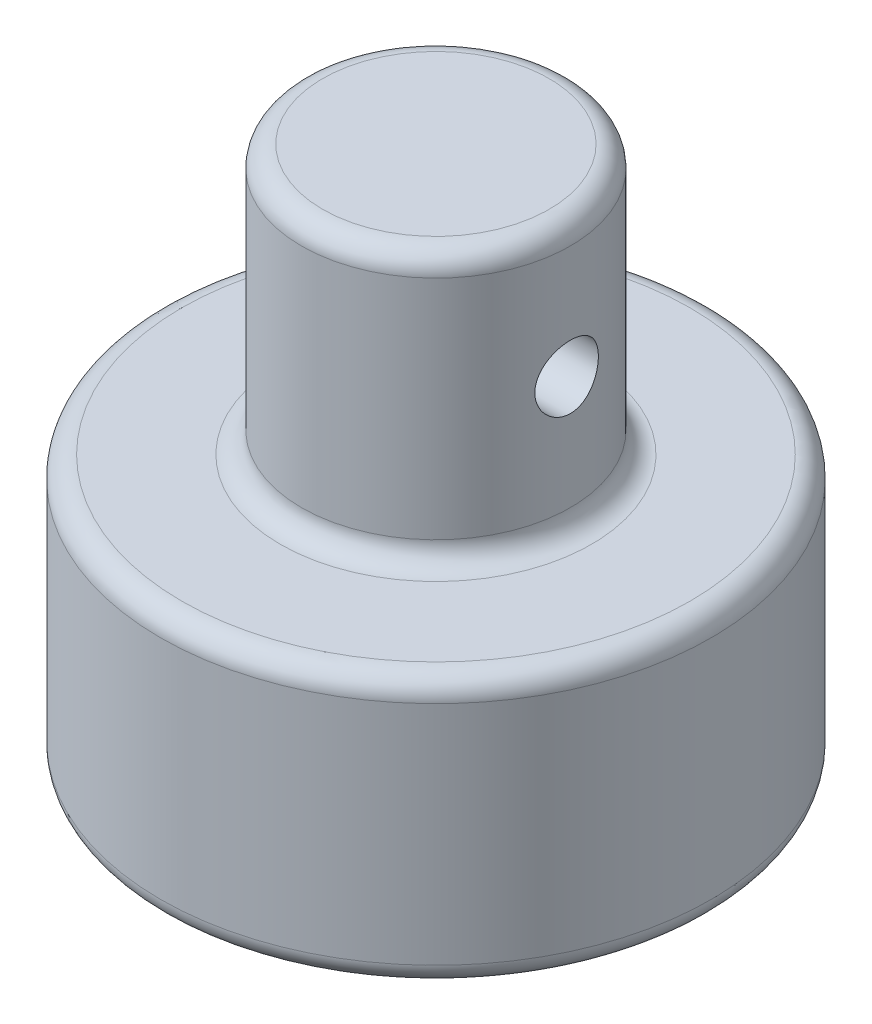
ISO-10303-21;
HEADER;
FILE_DESCRIPTION(('STEP AP214'),'2;1');
FILE_NAME('part.step','',(''),(''),'','','');
FILE_SCHEMA(('AUTOMOTIVE_DESIGN { 1 0 10303 214 1 1 1 1 }'));
ENDSEC;
DATA;
#1=APPLICATION_CONTEXT('core data for automotive mechanical design processes');
#2=APPLICATION_PROTOCOL_DEFINITION('international standard','automotive_design',2000,#1);
#3=PRODUCT_CONTEXT('',#1,'mechanical');
#4=PRODUCT('Part','Part','',(#3));
#5=PRODUCT_RELATED_PRODUCT_CATEGORY('part','',(#4));
#6=PRODUCT_DEFINITION_FORMATION('','',#4);
#7=PRODUCT_DEFINITION_CONTEXT('part definition',#1,'design');
#8=PRODUCT_DEFINITION('design','',#6,#7);
#9=PRODUCT_DEFINITION_SHAPE('','',#8);
#10=(LENGTH_UNIT() NAMED_UNIT(*) SI_UNIT(.MILLI.,.METRE.));
#11=(NAMED_UNIT(*) PLANE_ANGLE_UNIT() SI_UNIT($,.RADIAN.));
#12=(NAMED_UNIT(*) SI_UNIT($,.STERADIAN.) SOLID_ANGLE_UNIT());
#13=UNCERTAINTY_MEASURE_WITH_UNIT(LENGTH_MEASURE(1.E-05),#10,'distance_accuracy_value','');
#14=(GEOMETRIC_REPRESENTATION_CONTEXT(3) GLOBAL_UNCERTAINTY_ASSIGNED_CONTEXT((#13)) GLOBAL_UNIT_ASSIGNED_CONTEXT((#10,
#11,#12)) REPRESENTATION_CONTEXT('',''));
#15=CARTESIAN_POINT('',(0.,0.,0.));
#16=DIRECTION('',(0.,0.,1.));
#17=DIRECTION('',(1.,0.,0.));
#18=AXIS2_PLACEMENT_3D('',#15,#16,#17);
#19=CARTESIAN_POINT('',(0.,12.7,0.));
#20=DIRECTION('',(0.,-1.,0.));
#21=DIRECTION('',(0.,0.,-1.));
#22=AXIS2_PLACEMENT_3D('',#19,#20,#21);
#23=CYLINDRICAL_SURFACE('',#22,3.175);
#24=CARTESIAN_POINT('',(0.,12.2,0.));
#25=DIRECTION('',(0.,1.,0.));
#26=DIRECTION('',(0.,0.,1.));
#27=AXIS2_PLACEMENT_3D('',#24,#25,#26);
#28=CIRCLE('',#27,3.175);
#29=CARTESIAN_POINT('',(0.,12.2,3.175));
#30=VERTEX_POINT('',#29);
#31=EDGE_CURVE('E42',#30,#30,#28,.F.);
#32=ORIENTED_EDGE('',*,*,#31,.T.);
#33=EDGE_LOOP('',(#32));
#34=FACE_BOUND('',#33,.T.);
#35=CARTESIAN_POINT('',(0.,6.85,0.));
#36=DIRECTION('',(0.,1.,0.));
#37=DIRECTION('',(0.,0.,1.));
#38=AXIS2_PLACEMENT_3D('',#35,#36,#37);
#39=CIRCLE('',#38,3.175);
#40=CARTESIAN_POINT('',(0.,6.85,3.175));
#41=VERTEX_POINT('',#40);
#42=EDGE_CURVE('E46',#41,#41,#39,.T.);
#43=ORIENTED_EDGE('',*,*,#42,.T.);
#44=EDGE_LOOP('',(#43));
#45=FACE_BOUND('',#44,.T.);
#46=CARTESIAN_POINT('',(-3.08514586365053,9.525,0.75));
#47=CARTESIAN_POINT('',(-3.08514668896926,9.56649225643454,0.749998699655734));
#48=CARTESIAN_POINT('',(-3.08599204166002,9.60799944409923,0.746545063183195));
#49=CARTESIAN_POINT('',(-3.08927459498372,9.68982715153479,0.732840613698552));
#50=CARTESIAN_POINT('',(-3.0917128236692,9.73014688734081,0.722585410846177));
#51=CARTESIAN_POINT('',(-3.09788992836472,9.80840426361994,0.6956239444874));
#52=CARTESIAN_POINT('',(-3.10162724036179,9.84634470406624,0.678925435658918));
#53=CARTESIAN_POINT('',(-3.10997949528248,9.91888829161726,0.639574379245872));
#54=CARTESIAN_POINT('',(-3.11459445057715,9.95349139166926,0.616921747731687));
#55=CARTESIAN_POINT('',(-3.12428352892521,10.0190587833184,0.565830002157809));
#56=CARTESIAN_POINT('',(-3.12936433482267,10.0499478042755,0.537295540706709));
#57=CARTESIAN_POINT('',(-3.13935442508066,10.1065488701819,0.475455716733856));
#58=CARTESIAN_POINT('',(-3.144263694653,10.1322604696896,0.442149944131872));
#59=CARTESIAN_POINT('',(-3.15343099297809,10.1780801564261,0.371202233287074));
#60=CARTESIAN_POINT('',(-3.15768021537604,10.1981149995139,0.333511756182037));
#61=CARTESIAN_POINT('',(-3.16497274840128,10.2315373115901,0.255181288309081));
#62=CARTESIAN_POINT('',(-3.16801621736345,10.2449256534299,0.214541685638768));
#63=CARTESIAN_POINT('',(-3.17250709203822,10.2644357980443,0.132250407441323));
#64=CARTESIAN_POINT('',(-3.17398249847803,10.2706852367638,0.0906305468698862));
#65=CARTESIAN_POINT('',(-3.17526833011845,10.2761400985008,0.00690875719543005));
#66=CARTESIAN_POINT('',(-3.17507897609403,10.2753464555483,-0.035193107246283));
#67=CARTESIAN_POINT('',(-3.17307771962571,10.2668309712607,-0.117801007212341));
#68=CARTESIAN_POINT('',(-3.17129806206527,10.2592468080681,-0.158322132567599));
#69=CARTESIAN_POINT('',(-3.16635333031269,10.2375859988044,-0.237499581070946));
#70=CARTESIAN_POINT('',(-3.16318818708796,10.2235090292236,-0.276155811193009));
#71=CARTESIAN_POINT('',(-3.15577763422695,10.1891461179859,-0.350877735450184));
#72=CARTESIAN_POINT('',(-3.15152349750181,10.1688097341573,-0.386919331372022));
#73=CARTESIAN_POINT('',(-3.14239874221514,10.1225432208452,-0.455127485192185));
#74=CARTESIAN_POINT('',(-3.1375280268937,10.0966122129442,-0.487293433333832));
#75=CARTESIAN_POINT('',(-3.1275639356673,10.0391491200711,-0.547657439615753));
#76=CARTESIAN_POINT('',(-3.12246802405523,10.0074966114115,-0.575740555961048));
#77=CARTESIAN_POINT('',(-3.11273697520834,9.93987810522371,-0.626223926852375));
#78=CARTESIAN_POINT('',(-3.10810185505198,9.90391194792634,-0.648623970812585));
#79=CARTESIAN_POINT('',(-3.09980911131487,9.82847985280552,-0.687168473588018));
#80=CARTESIAN_POINT('',(-3.0961554015624,9.78900071418787,-0.703287997687938));
#81=CARTESIAN_POINT('',(-3.09029097273593,9.70778641412193,-0.728627245010572));
#82=CARTESIAN_POINT('',(-3.08807998196653,9.66605167905551,-0.737848267419286));
#83=CARTESIAN_POINT('',(-3.08540764265613,9.58256971063367,-0.748943766722535));
#84=CARTESIAN_POINT('',(-3.08490610896531,9.54084616771512,-0.750987011548172));
#85=CARTESIAN_POINT('',(-3.08560053051669,9.45765450591881,-0.748128667586499));
#86=CARTESIAN_POINT('',(-3.08679634789464,9.41618636657112,-0.743227642834893));
#87=CARTESIAN_POINT('',(-3.09071247686468,9.3352913390079,-0.726767178663562));
#88=CARTESIAN_POINT('',(-3.0934108350967,9.29584379103943,-0.715303557948252));
#89=CARTESIAN_POINT('',(-3.10000763947436,9.21942973735453,-0.686148403649578));
#90=CARTESIAN_POINT('',(-3.10390621571075,9.18246350111495,-0.668456194924241));
#91=CARTESIAN_POINT('',(-3.11255046676841,9.11133934800395,-0.626984422838589));
#92=CARTESIAN_POINT('',(-3.11730992644009,9.07724279265536,-0.603102559124364));
#93=CARTESIAN_POINT('',(-3.12710472283704,9.01347919120149,-0.550060780512039));
#94=CARTESIAN_POINT('',(-3.13214009975032,8.98381279271568,-0.52090009530867));
#95=CARTESIAN_POINT('',(-3.14205387017239,8.92908106085406,-0.457358782246775));
#96=CARTESIAN_POINT('',(-3.14692634672054,8.90413171806595,-0.422877157292954));
#97=CARTESIAN_POINT('',(-3.15584949293842,8.86037877034749,-0.350114896765158));
#98=CARTESIAN_POINT('',(-3.1599002038756,8.84157485677695,-0.31183445210417));
#99=CARTESIAN_POINT('',(-3.16669883080338,8.81080025065212,-0.232816585023149));
#100=CARTESIAN_POINT('',(-3.16945566324685,8.79878267133792,-0.192098226076688));
#101=CARTESIAN_POINT('',(-3.1733947431689,8.78177822559625,-0.109147060387728));
#102=CARTESIAN_POINT('',(-3.17457725998794,8.77679015652248,-0.06691451396867));
#103=CARTESIAN_POINT('',(-3.17522483844584,8.77404784145799,0.0167714737738158));
#104=CARTESIAN_POINT('',(-3.1747307499349,8.7761215425476,0.0582190516315513));
#105=CARTESIAN_POINT('',(-3.17216982115589,8.78705403632335,0.14015720888946));
#106=CARTESIAN_POINT('',(-3.17010301880818,8.79591266541523,0.180647811339406));
#107=CARTESIAN_POINT('',(-3.16463373692052,8.82007555758405,0.259363838319269));
#108=CARTESIAN_POINT('',(-3.16123708133291,8.83535173668918,0.297598314347804));
#109=CARTESIAN_POINT('',(-3.15346796297977,8.87188998424496,0.370982424318939));
#110=CARTESIAN_POINT('',(-3.14909538940119,8.89315273252731,0.406131707313622));
#111=CARTESIAN_POINT('',(-3.13972971971794,8.94160183781537,0.473174460292336));
#112=CARTESIAN_POINT('',(-3.13472520051864,8.96890691929889,0.504980541561487));
#113=CARTESIAN_POINT('',(-3.12471547407835,9.02843095166842,0.563617812471413));
#114=CARTESIAN_POINT('',(-3.11971026697297,9.06065111525591,0.59044777072009));
#115=CARTESIAN_POINT('',(-3.11017456306961,9.12971800766053,0.638793952479309));
#116=CARTESIAN_POINT('',(-3.10565305429953,9.16663114180078,0.660217206081042));
#117=CARTESIAN_POINT('',(-3.09771371445937,9.24363511299557,0.69652180308972));
#118=CARTESIAN_POINT('',(-3.09429502005866,9.28372343360348,0.711408267091613));
#119=CARTESIAN_POINT('',(-3.08952792485525,9.35732923306428,0.731796664056163));
#120=CARTESIAN_POINT('',(-3.08789633346475,9.39047159435581,0.738608876275777));
#121=CARTESIAN_POINT('',(-3.08570500249943,9.45740602969743,0.747710922812881));
#122=CARTESIAN_POINT('',(-3.0851451912992,9.4911980601787,0.750001059334016));
#123=CARTESIAN_POINT('',(-3.08514586365053,9.525,0.75));
#124=B_SPLINE_CURVE_WITH_KNOTS('',3,(#46,#47,#48,#49,#50,#51,#52,#53,#54,#55,#56,#57,#58,#59,
#60,#61,#62,#63,#64,#65,#66,#67,#68,#69,#70,#71,#72,#73,#74,#75,#76,#77,#78,#79,#80,#81,#82,#83,
#84,#85,#86,#87,#88,#89,#90,#91,#92,#93,#94,#95,#96,#97,#98,#99,#100,#101,#102,#103,#104,#105,
#106,#107,#108,#109,#110,#111,#112,#113,#114,#115,#116,#117,#118,#119,#120,#121,#122,#123),
.UNSPECIFIED.,.T.,.F.,(4,2,2,2,2,2,2,2,2,2,2,2,2,2,2,2,2,2,2,2,2,2,2,2,2,2,2,2,2,2,2,2,2,2,2,2,
2,2,4),(0.,0.124352756597841,0.248785850668864,0.373069651205348,0.497355203746668,
0.623841196362167,0.75033806660792,0.878399589302627,1.00644428987362,1.13216198242116,
1.25786300296017,1.38107173556274,1.50428660780916,1.62852163687889,1.75277618642629,
1.88003952195612,2.0073075725308,2.13507587161651,2.26282010220036,2.38753986054616,
2.51224948933644,2.63518308677905,2.75813001359882,2.88325528425149,3.00839882838906,
3.13630418523094,3.2642031173301,3.39120723181059,3.51818961510713,3.64210055717242,
3.7660085116628,3.8893797872764,4.01276507852263,4.13883263237193,4.26493134141276,
4.39306971156921,4.52110752466599,4.62241908709417,4.723723878791),.UNSPECIFIED.);
#125=CARTESIAN_POINT('',(-3.08514586365053,9.525,0.75));
#126=VERTEX_POINT('',#125);
#127=EDGE_CURVE('E70',#126,#126,#124,.T.);
#128=ORIENTED_EDGE('',*,*,#127,.F.);
#129=EDGE_LOOP('',(#128));
#130=FACE_BOUND('',#129,.T.);
#131=CARTESIAN_POINT('',(3.08514586365053,9.525,0.75));
#132=CARTESIAN_POINT('',(3.08514668896926,9.48350774356545,0.749998699655734));
#133=CARTESIAN_POINT('',(3.08599204166002,9.44200055590077,0.746545063183195));
#134=CARTESIAN_POINT('',(3.08927459498372,9.36017284846521,0.732840613698552));
#135=CARTESIAN_POINT('',(3.0917128236692,9.31985311265919,0.722585410846177));
#136=CARTESIAN_POINT('',(3.09788992836472,9.24159573638006,0.6956239444874));
#137=CARTESIAN_POINT('',(3.10162724036179,9.20365529593376,0.678925435658918));
#138=CARTESIAN_POINT('',(3.10997949528248,9.13111170838274,0.639574379245872));
#139=CARTESIAN_POINT('',(3.11459445057715,9.09650860833074,0.616921747731687));
#140=CARTESIAN_POINT('',(3.12428352892521,9.03094121668163,0.565830002157809));
#141=CARTESIAN_POINT('',(3.12936433482267,9.00005219572447,0.537295540706709));
#142=CARTESIAN_POINT('',(3.13935442508066,8.94345112981805,0.475455716733856));
#143=CARTESIAN_POINT('',(3.144263694653,8.91773953031042,0.442149944131872));
#144=CARTESIAN_POINT('',(3.15343099297809,8.8719198435739,0.371202233287074));
#145=CARTESIAN_POINT('',(3.15768021537604,8.85188500048607,0.333511756182037));
#146=CARTESIAN_POINT('',(3.16497274840128,8.81846268840987,0.255181288309081));
#147=CARTESIAN_POINT('',(3.16801621736345,8.80507434657011,0.214541685638768));
#148=CARTESIAN_POINT('',(3.17250709203822,8.7855642019557,0.132250407441323));
#149=CARTESIAN_POINT('',(3.17398249847803,8.77931476323623,0.0906305468698862));
#150=CARTESIAN_POINT('',(3.17526833011845,8.77385990149915,0.00690875719543005));
#151=CARTESIAN_POINT('',(3.17507897609403,8.77465354445174,-0.035193107246283));
#152=CARTESIAN_POINT('',(3.17307771962571,8.78316902873931,-0.117801007212341));
#153=CARTESIAN_POINT('',(3.17129806206527,8.79075319193186,-0.158322132567599));
#154=CARTESIAN_POINT('',(3.16635333031269,8.8124140011956,-0.237499581070946));
#155=CARTESIAN_POINT('',(3.16318818708796,8.82649097077644,-0.276155811193009));
#156=CARTESIAN_POINT('',(3.15577763422695,8.86085388201406,-0.350877735450184));
#157=CARTESIAN_POINT('',(3.15152349750181,8.88119026584269,-0.386919331372022));
#158=CARTESIAN_POINT('',(3.14239874221514,8.92745677915484,-0.455127485192185));
#159=CARTESIAN_POINT('',(3.1375280268937,8.95338778705577,-0.487293433333832));
#160=CARTESIAN_POINT('',(3.1275639356673,9.01085087992887,-0.547657439615753));
#161=CARTESIAN_POINT('',(3.12246802405523,9.04250338858851,-0.575740555961048));
#162=CARTESIAN_POINT('',(3.11273697520834,9.11012189477629,-0.626223926852375));
#163=CARTESIAN_POINT('',(3.10810185505198,9.14608805207366,-0.648623970812585));
#164=CARTESIAN_POINT('',(3.09980911131487,9.22152014719447,-0.687168473588018));
#165=CARTESIAN_POINT('',(3.0961554015624,9.26099928581213,-0.703287997687938));
#166=CARTESIAN_POINT('',(3.09029097273593,9.34221358587807,-0.728627245010572));
#167=CARTESIAN_POINT('',(3.08807998196653,9.38394832094449,-0.737848267419286));
#168=CARTESIAN_POINT('',(3.08540764265613,9.46743028936632,-0.748943766722535));
#169=CARTESIAN_POINT('',(3.08490610896531,9.50915383228488,-0.750987011548172));
#170=CARTESIAN_POINT('',(3.08560053051669,9.59234549408119,-0.748128667586499));
#171=CARTESIAN_POINT('',(3.08679634789464,9.63381363342888,-0.743227642834893));
#172=CARTESIAN_POINT('',(3.09071247686468,9.71470866099209,-0.726767178663562));
#173=CARTESIAN_POINT('',(3.0934108350967,9.75415620896056,-0.715303557948252));
#174=CARTESIAN_POINT('',(3.10000763947436,9.83057026264547,-0.686148403649578));
#175=CARTESIAN_POINT('',(3.10390621571075,9.86753649888505,-0.668456194924241));
#176=CARTESIAN_POINT('',(3.11255046676841,9.93866065199605,-0.626984422838589));
#177=CARTESIAN_POINT('',(3.11730992644009,9.97275720734464,-0.603102559124364));
#178=CARTESIAN_POINT('',(3.12710472283704,10.0365208087985,-0.550060780512039));
#179=CARTESIAN_POINT('',(3.13214009975032,10.0661872072843,-0.52090009530867));
#180=CARTESIAN_POINT('',(3.14205387017239,10.1209189391459,-0.457358782246775));
#181=CARTESIAN_POINT('',(3.14692634672054,10.145868281934,-0.422877157292954));
#182=CARTESIAN_POINT('',(3.15584949293842,10.1896212296525,-0.350114896765158));
#183=CARTESIAN_POINT('',(3.1599002038756,10.2084251432231,-0.311834452104169));
#184=CARTESIAN_POINT('',(3.16669883080338,10.2391997493479,-0.232816585023148));
#185=CARTESIAN_POINT('',(3.16945566324685,10.2512173286621,-0.192098226076688));
#186=CARTESIAN_POINT('',(3.1733947431689,10.2682217744037,-0.109147060387728));
#187=CARTESIAN_POINT('',(3.17457725998794,10.2732098434775,-0.0669145139686699));
#188=CARTESIAN_POINT('',(3.17522483844584,10.275952158542,0.0167714737738159));
#189=CARTESIAN_POINT('',(3.1747307499349,10.2738784574524,0.0582190516315513));
#190=CARTESIAN_POINT('',(3.17216982115589,10.2629459636766,0.14015720888946));
#191=CARTESIAN_POINT('',(3.17010301880818,10.2540873345848,0.180647811339406));
#192=CARTESIAN_POINT('',(3.16463373692052,10.2299244424159,0.259363838319269));
#193=CARTESIAN_POINT('',(3.16123708133291,10.2146482633108,0.297598314347804));
#194=CARTESIAN_POINT('',(3.15346796297977,10.178110015755,0.37098242431894));
#195=CARTESIAN_POINT('',(3.14909538940119,10.1568472674727,0.406131707313622));
#196=CARTESIAN_POINT('',(3.13972971971794,10.1083981621846,0.473174460292336));
#197=CARTESIAN_POINT('',(3.13472520051864,10.0810930807011,0.504980541561487));
#198=CARTESIAN_POINT('',(3.12471547407835,10.0215690483316,0.563617812471413));
#199=CARTESIAN_POINT('',(3.11971026697297,9.98934888474409,0.59044777072009));
#200=CARTESIAN_POINT('',(3.11017456306961,9.92028199233946,0.638793952479309));
#201=CARTESIAN_POINT('',(3.10565305429953,9.88336885819922,0.660217206081042));
#202=CARTESIAN_POINT('',(3.09771371445937,9.80636488700443,0.69652180308972));
#203=CARTESIAN_POINT('',(3.09429502005866,9.76627656639652,0.711408267091613));
#204=CARTESIAN_POINT('',(3.08952792485525,9.69267076693572,0.731796664056163));
#205=CARTESIAN_POINT('',(3.08789633346475,9.65952840564419,0.738608876275777));
#206=CARTESIAN_POINT('',(3.08570500249943,9.59259397030256,0.747710922812881));
#207=CARTESIAN_POINT('',(3.0851451912992,9.5588019398213,0.750001059334016));
#208=CARTESIAN_POINT('',(3.08514586365053,9.525,0.75));
#209=B_SPLINE_CURVE_WITH_KNOTS('',3,(#131,#132,#133,#134,#135,#136,#137,#138,#139,#140,#141,
#142,#143,#144,#145,#146,#147,#148,#149,#150,#151,#152,#153,#154,#155,#156,#157,#158,#159,#160,
#161,#162,#163,#164,#165,#166,#167,#168,#169,#170,#171,#172,#173,#174,#175,#176,#177,#178,#179,
#180,#181,#182,#183,#184,#185,#186,#187,#188,#189,#190,#191,#192,#193,#194,#195,#196,#197,#198,
#199,#200,#201,#202,#203,#204,#205,#206,#207,#208),.UNSPECIFIED.,.T.,.F.,(4,2,2,2,2,2,2,2,2,2,2,
2,2,2,2,2,2,2,2,2,2,2,2,2,2,2,2,2,2,2,2,2,2,2,2,2,2,2,4),(0.,0.124352756597841,
0.248785850668864,0.373069651205348,0.497355203746668,0.623841196362167,0.75033806660792,
0.878399589302627,1.00644428987362,1.13216198242116,1.25786300296017,1.38107173556274,
1.50428660780916,1.62852163687889,1.75277618642629,1.88003952195612,2.0073075725308,
2.13507587161651,2.26282010220036,2.38753986054616,2.51224948933644,2.63518308677905,
2.75813001359882,2.88325528425149,3.00839882838906,3.13630418523094,3.2642031173301,
3.39120723181059,3.51818961510713,3.64210055717242,3.7660085116628,3.8893797872764,
4.01276507852263,4.13883263237193,4.26493134141276,4.39306971156921,4.52110752466599,
4.62241908709417,4.723723878791),.UNSPECIFIED.);
#210=CARTESIAN_POINT('',(3.08514586365053,9.525,0.75));
#211=VERTEX_POINT('',#210);
#212=EDGE_CURVE('E63',#211,#211,#209,.T.);
#213=ORIENTED_EDGE('',*,*,#212,.F.);
#214=EDGE_LOOP('',(#213));
#215=FACE_BOUND('',#214,.T.);
#216=ADVANCED_FACE('F31',(#34,#45,#130,#215),#23,.T.);
#217=CARTESIAN_POINT('',(0.,6.35,0.));
#218=DIRECTION('',(0.,-1.,0.));
#219=DIRECTION('',(0.,0.,-1.));
#220=AXIS2_PLACEMENT_3D('',#217,#218,#219);
#221=CYLINDRICAL_SURFACE('',#220,6.5);
#222=CARTESIAN_POINT('',(0.,0.5,0.));
#223=DIRECTION('',(0.,1.,0.));
#224=DIRECTION('',(0.,0.,1.));
#225=AXIS2_PLACEMENT_3D('',#222,#223,#224);
#226=CIRCLE('',#225,6.5);
#227=CARTESIAN_POINT('',(0.,0.5,6.5));
#228=VERTEX_POINT('',#227);
#229=EDGE_CURVE('E57',#228,#228,#226,.T.);
#230=ORIENTED_EDGE('',*,*,#229,.T.);
#231=EDGE_LOOP('',(#230));
#232=FACE_BOUND('',#231,.T.);
#233=CARTESIAN_POINT('',(0.,5.85,0.));
#234=DIRECTION('',(0.,1.,0.));
#235=DIRECTION('',(0.,0.,1.));
#236=AXIS2_PLACEMENT_3D('',#233,#234,#235);
#237=CIRCLE('',#236,6.5);
#238=CARTESIAN_POINT('',(0.,5.85,6.5));
#239=VERTEX_POINT('',#238);
#240=EDGE_CURVE('E60',#239,#239,#237,.F.);
#241=ORIENTED_EDGE('',*,*,#240,.T.);
#242=EDGE_LOOP('',(#241));
#243=FACE_BOUND('',#242,.T.);
#244=ADVANCED_FACE('F93',(#232,#243),#221,.T.);
#245=CARTESIAN_POINT('',(0.,6.35,0.));
#246=DIRECTION('',(0.,1.,0.));
#247=DIRECTION('',(0.,0.,1.));
#248=AXIS2_PLACEMENT_3D('',#245,#246,#247);
#249=PLANE('',#248);
#250=CARTESIAN_POINT('',(0.,6.35,0.));
#251=DIRECTION('',(0.,1.,0.));
#252=DIRECTION('',(0.,0.,1.));
#253=AXIS2_PLACEMENT_3D('',#250,#251,#252);
#254=CIRCLE('',#253,6.);
#255=CARTESIAN_POINT('',(0.,6.35,6.));
#256=VERTEX_POINT('',#255);
#257=EDGE_CURVE('E10',#256,#256,#254,.T.);
#258=ORIENTED_EDGE('',*,*,#257,.T.);
#259=EDGE_LOOP('',(#258));
#260=FACE_BOUND('',#259,.T.);
#261=CARTESIAN_POINT('',(0.,6.35,0.));
#262=DIRECTION('',(0.,1.,0.));
#263=DIRECTION('',(0.,0.,1.));
#264=AXIS2_PLACEMENT_3D('',#261,#262,#263);
#265=CIRCLE('',#264,3.675);
#266=CARTESIAN_POINT('',(0.,6.35,3.675));
#267=VERTEX_POINT('',#266);
#268=EDGE_CURVE('E38',#267,#267,#265,.F.);
#269=ORIENTED_EDGE('',*,*,#268,.T.);
#270=EDGE_LOOP('',(#269));
#271=FACE_BOUND('',#270,.T.);
#272=ADVANCED_FACE('F89',(#260,#271),#249,.T.);
#273=CARTESIAN_POINT('',(0.,0.,0.));
#274=DIRECTION('',(0.,1.,0.));
#275=DIRECTION('',(0.,0.,1.));
#276=AXIS2_PLACEMENT_3D('',#273,#274,#275);
#277=PLANE('',#276);
#278=CARTESIAN_POINT('',(0.,0.,0.));
#279=DIRECTION('',(0.,1.,0.));
#280=DIRECTION('',(0.,0.,1.));
#281=AXIS2_PLACEMENT_3D('',#278,#279,#280);
#282=CIRCLE('',#281,6.);
#283=CARTESIAN_POINT('',(0.,0.,6.));
#284=VERTEX_POINT('',#283);
#285=EDGE_CURVE('E54',#284,#284,#282,.F.);
#286=ORIENTED_EDGE('',*,*,#285,.T.);
#287=EDGE_LOOP('',(#286));
#288=FACE_BOUND('',#287,.T.);
#289=ADVANCED_FACE('F84',(#288),#277,.F.);
#290=CARTESIAN_POINT('',(0.,12.7,0.));
#291=DIRECTION('',(0.,1.,0.));
#292=DIRECTION('',(0.,0.,1.));
#293=AXIS2_PLACEMENT_3D('',#290,#291,#292);
#294=PLANE('',#293);
#295=CARTESIAN_POINT('',(0.,12.7,0.));
#296=DIRECTION('',(0.,1.,0.));
#297=DIRECTION('',(0.,0.,1.));
#298=AXIS2_PLACEMENT_3D('',#295,#296,#297);
#299=CIRCLE('',#298,2.675);
#300=CARTESIAN_POINT('',(0.,12.7,2.675));
#301=VERTEX_POINT('',#300);
#302=EDGE_CURVE('E51',#301,#301,#299,.T.);
#303=ORIENTED_EDGE('',*,*,#302,.T.);
#304=EDGE_LOOP('',(#303));
#305=FACE_BOUND('',#304,.T.);
#306=ADVANCED_FACE('F80',(#305),#294,.T.);
#307=CARTESIAN_POINT('',(6.35,9.525,0.));
#308=DIRECTION('',(-1.,0.,0.));
#309=DIRECTION('',(0.,0.,1.));
#310=AXIS2_PLACEMENT_3D('',#307,#308,#309);
#311=CYLINDRICAL_SURFACE('',#310,0.75);
#312=ORIENTED_EDGE('',*,*,#127,.T.);
#313=EDGE_LOOP('',(#312));
#314=FACE_BOUND('',#313,.T.);
#315=ORIENTED_EDGE('',*,*,#212,.T.);
#316=EDGE_LOOP('',(#315));
#317=FACE_BOUND('',#316,.T.);
#318=ADVANCED_FACE('F76',(#314,#317),#311,.F.);
#319=CARTESIAN_POINT('',(0.,0.5,0.));
#320=DIRECTION('',(0.,1.,0.));
#321=DIRECTION('',(0.,0.,1.));
#322=AXIS2_PLACEMENT_3D('',#319,#320,#321);
#323=TOROIDAL_SURFACE('',#322,6.,0.5);
#324=ORIENTED_EDGE('',*,*,#285,.F.);
#325=EDGE_LOOP('',(#324));
#326=FACE_BOUND('',#325,.T.);
#327=ORIENTED_EDGE('',*,*,#229,.F.);
#328=EDGE_LOOP('',(#327));
#329=FACE_BOUND('',#328,.T.);
#330=ADVANCED_FACE('F79',(#326,#329),#323,.T.);
#331=CARTESIAN_POINT('',(0.,12.2,0.));
#332=DIRECTION('',(0.,1.,0.));
#333=DIRECTION('',(0.,0.,1.));
#334=AXIS2_PLACEMENT_3D('',#331,#332,#333);
#335=TOROIDAL_SURFACE('',#334,2.675,0.5);
#336=ORIENTED_EDGE('',*,*,#31,.F.);
#337=EDGE_LOOP('',(#336));
#338=FACE_BOUND('',#337,.T.);
#339=ORIENTED_EDGE('',*,*,#302,.F.);
#340=EDGE_LOOP('',(#339));
#341=FACE_BOUND('',#340,.T.);
#342=ADVANCED_FACE('F116',(#338,#341),#335,.T.);
#343=CARTESIAN_POINT('',(0.,5.85,0.));
#344=DIRECTION('',(0.,1.,0.));
#345=DIRECTION('',(0.,0.,1.));
#346=AXIS2_PLACEMENT_3D('',#343,#344,#345);
#347=TOROIDAL_SURFACE('',#346,6.,0.5);
#348=ORIENTED_EDGE('',*,*,#240,.F.);
#349=EDGE_LOOP('',(#348));
#350=FACE_BOUND('',#349,.T.);
#351=ORIENTED_EDGE('',*,*,#257,.F.);
#352=EDGE_LOOP('',(#351));
#353=FACE_BOUND('',#352,.T.);
#354=ADVANCED_FACE('F111',(#350,#353),#347,.T.);
#355=CARTESIAN_POINT('',(0.,6.85,0.));
#356=DIRECTION('',(0.,1.,0.));
#357=DIRECTION('',(0.,0.,1.));
#358=AXIS2_PLACEMENT_3D('',#355,#356,#357);
#359=TOROIDAL_SURFACE('',#358,3.675,0.5);
#360=ORIENTED_EDGE('',*,*,#268,.F.);
#361=EDGE_LOOP('',(#360));
#362=FACE_BOUND('',#361,.T.);
#363=ORIENTED_EDGE('',*,*,#42,.F.);
#364=EDGE_LOOP('',(#363));
#365=FACE_BOUND('',#364,.T.);
#366=ADVANCED_FACE('F33',(#362,#365),#359,.F.);
#367=CLOSED_SHELL('',(#216,#244,#272,#289,#306,#318,#330,#342,#354,#366));
#368=MANIFOLD_SOLID_BREP('B2',#367);
#369=ADVANCED_BREP_SHAPE_REPRESENTATION('',(#18,#368),#14);
#370=SHAPE_DEFINITION_REPRESENTATION(#9,#369);
ENDSEC;
END-ISO-10303-21;
